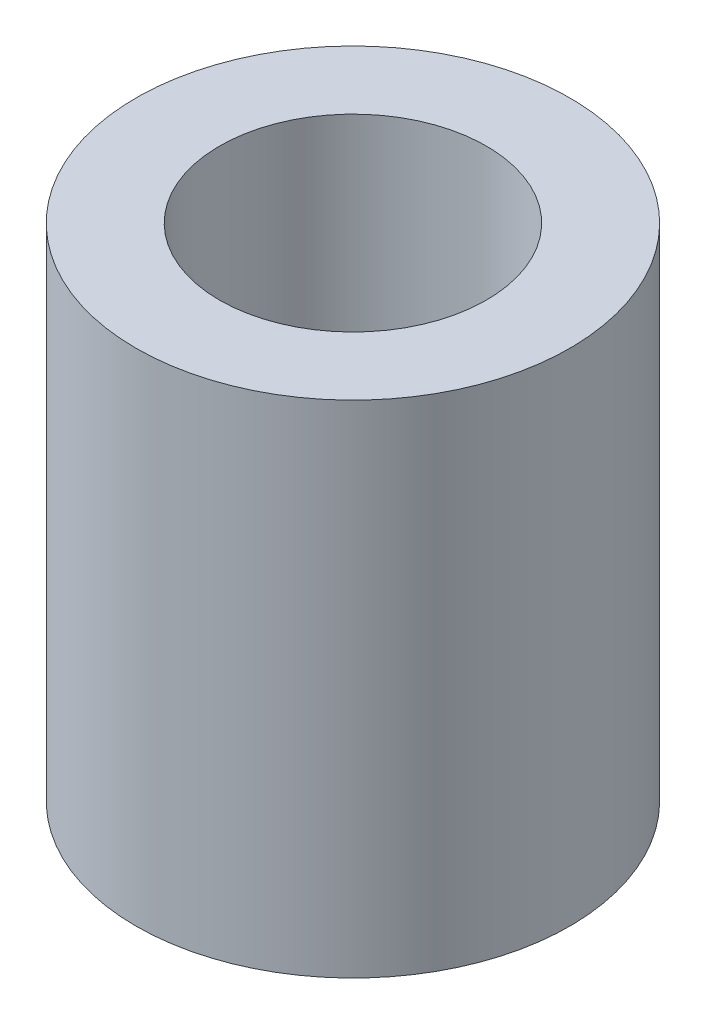
ISO-10303-21;
HEADER;
FILE_DESCRIPTION(('STEP AP214'),'2;1');
FILE_NAME('part.step','',(''),(''),'','','');
FILE_SCHEMA(('AUTOMOTIVE_DESIGN { 1 0 10303 214 1 1 1 1 }'));
ENDSEC;
DATA;
#1=APPLICATION_CONTEXT('core data for automotive mechanical design processes');
#2=APPLICATION_PROTOCOL_DEFINITION('international standard','automotive_design',2000,#1);
#3=PRODUCT_CONTEXT('',#1,'mechanical');
#4=PRODUCT('Part','Part','',(#3));
#5=PRODUCT_RELATED_PRODUCT_CATEGORY('part','',(#4));
#6=PRODUCT_DEFINITION_FORMATION('','',#4);
#7=PRODUCT_DEFINITION_CONTEXT('part definition',#1,'design');
#8=PRODUCT_DEFINITION('design','',#6,#7);
#9=PRODUCT_DEFINITION_SHAPE('','',#8);
#10=(LENGTH_UNIT() NAMED_UNIT(*) SI_UNIT(.MILLI.,.METRE.));
#11=(NAMED_UNIT(*) PLANE_ANGLE_UNIT() SI_UNIT($,.RADIAN.));
#12=(NAMED_UNIT(*) SI_UNIT($,.STERADIAN.) SOLID_ANGLE_UNIT());
#13=UNCERTAINTY_MEASURE_WITH_UNIT(LENGTH_MEASURE(1.E-05),#10,'distance_accuracy_value','');
#14=(GEOMETRIC_REPRESENTATION_CONTEXT(3) GLOBAL_UNCERTAINTY_ASSIGNED_CONTEXT((#13)) GLOBAL_UNIT_ASSIGNED_CONTEXT((#10,
#11,#12)) REPRESENTATION_CONTEXT('',''));
#15=CARTESIAN_POINT('',(0.,0.,0.));
#16=DIRECTION('',(0.,0.,1.));
#17=DIRECTION('',(1.,0.,0.));
#18=AXIS2_PLACEMENT_3D('',#15,#16,#17);
#19=CARTESIAN_POINT('',(0.,15.,0.));
#20=DIRECTION('',(0.,1.,0.));
#21=DIRECTION('',(0.,0.,1.));
#22=AXIS2_PLACEMENT_3D('',#19,#20,#21);
#23=PLANE('',#22);
#24=CARTESIAN_POINT('',(0.,15.,0.));
#25=DIRECTION('',(0.,1.,0.));
#26=DIRECTION('',(0.,0.,1.));
#27=AXIS2_PLACEMENT_3D('',#24,#25,#26);
#28=CIRCLE('',#27,6.5);
#29=CARTESIAN_POINT('',(0.,15.,6.5));
#30=VERTEX_POINT('',#29);
#31=EDGE_CURVE('E10',#30,#30,#28,.T.);
#32=ORIENTED_EDGE('',*,*,#31,.T.);
#33=EDGE_LOOP('',(#32));
#34=FACE_BOUND('',#33,.T.);
#35=CARTESIAN_POINT('',(0.,15.,0.));
#36=DIRECTION('',(0.,1.,0.));
#37=DIRECTION('',(0.,0.,1.));
#38=AXIS2_PLACEMENT_3D('',#35,#36,#37);
#39=CIRCLE('',#38,4.);
#40=CARTESIAN_POINT('',(0.,15.,4.));
#41=VERTEX_POINT('',#40);
#42=EDGE_CURVE('E41',#41,#41,#39,.T.);
#43=ORIENTED_EDGE('',*,*,#42,.F.);
#44=EDGE_LOOP('',(#43));
#45=FACE_BOUND('',#44,.T.);
#46=ADVANCED_FACE('F30',(#34,#45),#23,.T.);
#47=CARTESIAN_POINT('',(0.,0.,0.));
#48=DIRECTION('',(0.,1.,0.));
#49=DIRECTION('',(0.,0.,1.));
#50=AXIS2_PLACEMENT_3D('',#47,#48,#49);
#51=PLANE('',#50);
#52=CARTESIAN_POINT('',(0.,0.,0.));
#53=DIRECTION('',(0.,1.,0.));
#54=DIRECTION('',(0.,0.,1.));
#55=AXIS2_PLACEMENT_3D('',#52,#53,#54);
#56=CIRCLE('',#55,6.5);
#57=CARTESIAN_POINT('',(0.,0.,6.5));
#58=VERTEX_POINT('',#57);
#59=EDGE_CURVE('E34',#58,#58,#56,.T.);
#60=ORIENTED_EDGE('',*,*,#59,.F.);
#61=EDGE_LOOP('',(#60));
#62=FACE_BOUND('',#61,.T.);
#63=CARTESIAN_POINT('',(0.,0.,0.));
#64=DIRECTION('',(0.,1.,0.));
#65=DIRECTION('',(0.,0.,1.));
#66=AXIS2_PLACEMENT_3D('',#63,#64,#65);
#67=CIRCLE('',#66,4.);
#68=CARTESIAN_POINT('',(0.,0.,4.));
#69=VERTEX_POINT('',#68);
#70=EDGE_CURVE('E43',#69,#69,#67,.T.);
#71=ORIENTED_EDGE('',*,*,#70,.T.);
#72=EDGE_LOOP('',(#71));
#73=FACE_BOUND('',#72,.T.);
#74=ADVANCED_FACE('F53',(#62,#73),#51,.F.);
#75=CARTESIAN_POINT('',(0.,15.,0.));
#76=DIRECTION('',(0.,-1.,0.));
#77=DIRECTION('',(0.,0.,-1.));
#78=AXIS2_PLACEMENT_3D('',#75,#76,#77);
#79=CYLINDRICAL_SURFACE('',#78,6.5);
#80=ORIENTED_EDGE('',*,*,#31,.F.);
#81=EDGE_LOOP('',(#80));
#82=FACE_BOUND('',#81,.T.);
#83=ORIENTED_EDGE('',*,*,#59,.T.);
#84=EDGE_LOOP('',(#83));
#85=FACE_BOUND('',#84,.T.);
#86=ADVANCED_FACE('F32',(#82,#85),#79,.T.);
#87=CARTESIAN_POINT('',(0.,15.,0.));
#88=DIRECTION('',(0.,-1.,0.));
#89=DIRECTION('',(0.,0.,-1.));
#90=AXIS2_PLACEMENT_3D('',#87,#88,#89);
#91=CYLINDRICAL_SURFACE('',#90,4.);
#92=ORIENTED_EDGE('',*,*,#42,.T.);
#93=EDGE_LOOP('',(#92));
#94=FACE_BOUND('',#93,.T.);
#95=ORIENTED_EDGE('',*,*,#70,.F.);
#96=EDGE_LOOP('',(#95));
#97=FACE_BOUND('',#96,.T.);
#98=ADVANCED_FACE('F49',(#94,#97),#91,.F.);
#99=CLOSED_SHELL('',(#46,#74,#86,#98));
#100=MANIFOLD_SOLID_BREP('B2',#99);
#101=ADVANCED_BREP_SHAPE_REPRESENTATION('',(#18,#100),#14);
#102=SHAPE_DEFINITION_REPRESENTATION(#9,#101);
ENDSEC;
END-ISO-10303-21;
